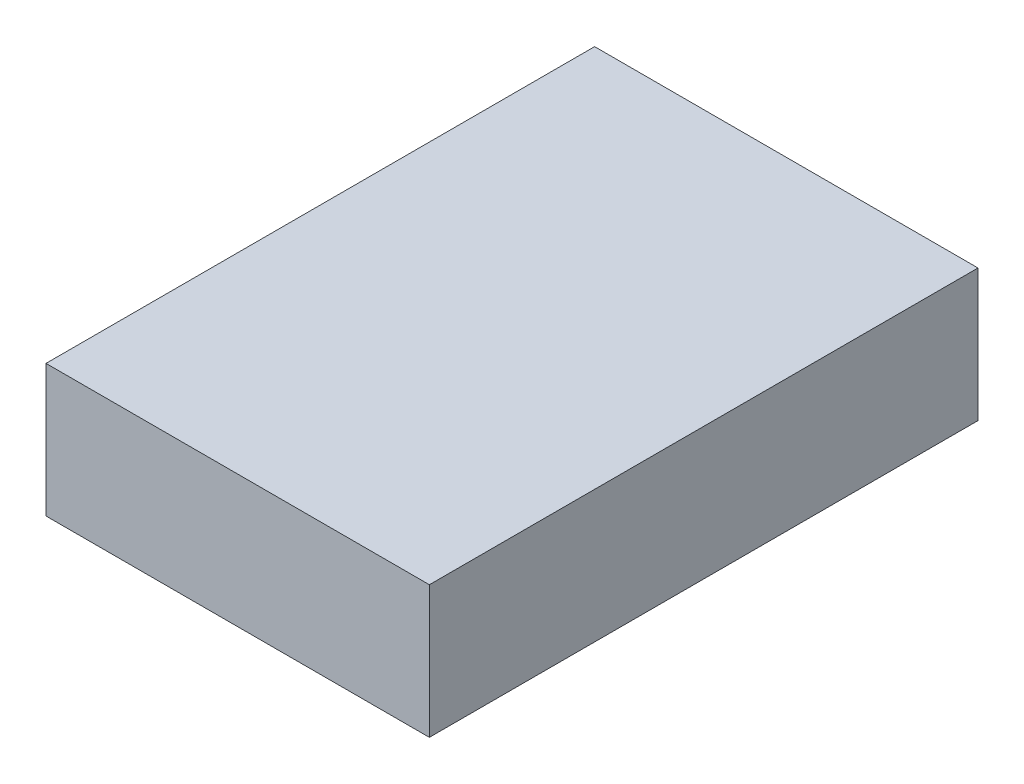
ISO-10303-21;
HEADER;
FILE_DESCRIPTION(('STEP AP214'),'2;1');
FILE_NAME('part.step','',(''),(''),'','','');
FILE_SCHEMA(('AUTOMOTIVE_DESIGN { 1 0 10303 214 1 1 1 1 }'));
ENDSEC;
DATA;
#1=APPLICATION_CONTEXT('core data for automotive mechanical design processes');
#2=APPLICATION_PROTOCOL_DEFINITION('international standard','automotive_design',2000,#1);
#3=PRODUCT_CONTEXT('',#1,'mechanical');
#4=PRODUCT('Part','Part','',(#3));
#5=PRODUCT_RELATED_PRODUCT_CATEGORY('part','',(#4));
#6=PRODUCT_DEFINITION_FORMATION('','',#4);
#7=PRODUCT_DEFINITION_CONTEXT('part definition',#1,'design');
#8=PRODUCT_DEFINITION('design','',#6,#7);
#9=PRODUCT_DEFINITION_SHAPE('','',#8);
#10=(LENGTH_UNIT() NAMED_UNIT(*) SI_UNIT(.MILLI.,.METRE.));
#11=(NAMED_UNIT(*) PLANE_ANGLE_UNIT() SI_UNIT($,.RADIAN.));
#12=(NAMED_UNIT(*) SI_UNIT($,.STERADIAN.) SOLID_ANGLE_UNIT());
#13=UNCERTAINTY_MEASURE_WITH_UNIT(LENGTH_MEASURE(1.E-05),#10,'distance_accuracy_value','');
#14=(GEOMETRIC_REPRESENTATION_CONTEXT(3) GLOBAL_UNCERTAINTY_ASSIGNED_CONTEXT((#13)) GLOBAL_UNIT_ASSIGNED_CONTEXT((#10,
#11,#12)) REPRESENTATION_CONTEXT('',''));
#15=CARTESIAN_POINT('',(0.,0.,0.));
#16=DIRECTION('',(0.,0.,1.));
#17=DIRECTION('',(1.,0.,0.));
#18=AXIS2_PLACEMENT_3D('',#15,#16,#17);
#19=CARTESIAN_POINT('',(-33.3733681462141,20.,-15.2780678851175));
#20=DIRECTION('',(1.,0.,0.));
#21=DIRECTION('',(0.,0.,-1.));
#22=AXIS2_PLACEMENT_3D('',#19,#20,#21);
#23=PLANE('',#22);
#24=DIRECTION('',(0.,0.,1.));
#25=VECTOR('',#24,1.);
#26=CARTESIAN_POINT('',(-33.3733681462141,0.,-15.2780678851175));
#27=LINE('',#26,#25);
#28=CARTESIAN_POINT('',(-33.3733681462141,0.,-15.2780678851175));
#29=VERTEX_POINT('',#28);
#30=CARTESIAN_POINT('',(-33.3733681462141,0.,67.7219321148825));
#31=VERTEX_POINT('',#30);
#32=EDGE_CURVE('E96',#29,#31,#27,.T.);
#33=ORIENTED_EDGE('',*,*,#32,.T.);
#34=DIRECTION('',(0.,-1.,0.));
#35=VECTOR('',#34,1.);
#36=CARTESIAN_POINT('',(-33.3733681462141,20.,67.7219321148825));
#37=LINE('',#36,#35);
#38=CARTESIAN_POINT('',(-33.3733681462141,20.,67.7219321148825));
#39=VERTEX_POINT('',#38);
#40=EDGE_CURVE('E11',#39,#31,#37,.T.);
#41=ORIENTED_EDGE('',*,*,#40,.F.);
#42=DIRECTION('',(0.,0.,1.));
#43=VECTOR('',#42,1.);
#44=CARTESIAN_POINT('',(-33.3733681462141,20.,-15.2780678851175));
#45=LINE('',#44,#43);
#46=CARTESIAN_POINT('',(-33.3733681462141,20.,-15.2780678851175));
#47=VERTEX_POINT('',#46);
#48=EDGE_CURVE('E84',#47,#39,#45,.T.);
#49=ORIENTED_EDGE('',*,*,#48,.F.);
#50=DIRECTION('',(0.,-1.,0.));
#51=VECTOR('',#50,1.);
#52=CARTESIAN_POINT('',(-33.3733681462141,20.,-15.2780678851175));
#53=LINE('',#52,#51);
#54=EDGE_CURVE('E92',#47,#29,#53,.T.);
#55=ORIENTED_EDGE('',*,*,#54,.T.);
#56=EDGE_LOOP('',(#33,#41,#49,#55));
#57=FACE_BOUND('',#56,.T.);
#58=ADVANCED_FACE('F33',(#57),#23,.F.);
#59=CARTESIAN_POINT('',(-33.3733681462141,20.,67.7219321148825));
#60=DIRECTION('',(0.,0.,-1.));
#61=DIRECTION('',(-1.,0.,0.));
#62=AXIS2_PLACEMENT_3D('',#59,#60,#61);
#63=PLANE('',#62);
#64=DIRECTION('',(1.,0.,0.));
#65=VECTOR('',#64,1.);
#66=CARTESIAN_POINT('',(-33.3733681462141,0.,67.7219321148825));
#67=LINE('',#66,#65);
#68=CARTESIAN_POINT('',(24.6266318537859,0.,67.7219321148825));
#69=VERTEX_POINT('',#68);
#70=EDGE_CURVE('E88',#31,#69,#67,.T.);
#71=ORIENTED_EDGE('',*,*,#70,.T.);
#72=DIRECTION('',(0.,-1.,0.));
#73=VECTOR('',#72,1.);
#74=CARTESIAN_POINT('',(24.6266318537859,20.,67.7219321148825));
#75=LINE('',#74,#73);
#76=CARTESIAN_POINT('',(24.6266318537859,20.,67.7219321148825));
#77=VERTEX_POINT('',#76);
#78=EDGE_CURVE('E41',#77,#69,#75,.T.);
#79=ORIENTED_EDGE('',*,*,#78,.F.);
#80=DIRECTION('',(1.,0.,0.));
#81=VECTOR('',#80,1.);
#82=CARTESIAN_POINT('',(-33.3733681462141,20.,67.7219321148825));
#83=LINE('',#82,#81);
#84=EDGE_CURVE('E79',#39,#77,#83,.T.);
#85=ORIENTED_EDGE('',*,*,#84,.F.);
#86=ORIENTED_EDGE('',*,*,#40,.T.);
#87=EDGE_LOOP('',(#71,#79,#85,#86));
#88=FACE_BOUND('',#87,.T.);
#89=ADVANCED_FACE('F87',(#88),#63,.F.);
#90=CARTESIAN_POINT('',(24.6266318537859,20.,-15.2780678851175));
#91=DIRECTION('',(-1.,0.,0.));
#92=DIRECTION('',(0.,0.,1.));
#93=AXIS2_PLACEMENT_3D('',#90,#91,#92);
#94=PLANE('',#93);
#95=DIRECTION('',(0.,0.,-1.));
#96=VECTOR('',#95,1.);
#97=CARTESIAN_POINT('',(24.6266318537859,0.,-15.2780678851175));
#98=LINE('',#97,#96);
#99=CARTESIAN_POINT('',(24.6266318537859,0.,-15.2780678851175));
#100=VERTEX_POINT('',#99);
#101=EDGE_CURVE('E66',#69,#100,#98,.T.);
#102=ORIENTED_EDGE('',*,*,#101,.T.);
#103=DIRECTION('',(0.,-1.,0.));
#104=VECTOR('',#103,1.);
#105=CARTESIAN_POINT('',(24.6266318537859,20.,-15.2780678851175));
#106=LINE('',#105,#104);
#107=CARTESIAN_POINT('',(24.6266318537859,20.,-15.2780678851175));
#108=VERTEX_POINT('',#107);
#109=EDGE_CURVE('E89',#108,#100,#106,.T.);
#110=ORIENTED_EDGE('',*,*,#109,.F.);
#111=DIRECTION('',(0.,0.,-1.));
#112=VECTOR('',#111,1.);
#113=CARTESIAN_POINT('',(24.6266318537859,20.,-15.2780678851175));
#114=LINE('',#113,#112);
#115=EDGE_CURVE('E82',#77,#108,#114,.T.);
#116=ORIENTED_EDGE('',*,*,#115,.F.);
#117=ORIENTED_EDGE('',*,*,#78,.T.);
#118=EDGE_LOOP('',(#102,#110,#116,#117));
#119=FACE_BOUND('',#118,.T.);
#120=ADVANCED_FACE('F90',(#119),#94,.F.);
#121=CARTESIAN_POINT('',(-33.3733681462141,20.,-15.2780678851175));
#122=DIRECTION('',(0.,0.,1.));
#123=DIRECTION('',(1.,0.,0.));
#124=AXIS2_PLACEMENT_3D('',#121,#122,#123);
#125=PLANE('',#124);
#126=DIRECTION('',(-1.,0.,0.));
#127=VECTOR('',#126,1.);
#128=CARTESIAN_POINT('',(-33.3733681462141,0.,-15.2780678851175));
#129=LINE('',#128,#127);
#130=EDGE_CURVE('E72',#100,#29,#129,.T.);
#131=ORIENTED_EDGE('',*,*,#130,.T.);
#132=ORIENTED_EDGE('',*,*,#54,.F.);
#133=DIRECTION('',(-1.,0.,0.));
#134=VECTOR('',#133,1.);
#135=CARTESIAN_POINT('',(-33.3733681462141,20.,-15.2780678851175));
#136=LINE('',#135,#134);
#137=EDGE_CURVE('E49',#108,#47,#136,.T.);
#138=ORIENTED_EDGE('',*,*,#137,.F.);
#139=ORIENTED_EDGE('',*,*,#109,.T.);
#140=EDGE_LOOP('',(#131,#132,#138,#139));
#141=FACE_BOUND('',#140,.T.);
#142=ADVANCED_FACE('F103',(#141),#125,.F.);
#143=CARTESIAN_POINT('',(0.,20.,0.));
#144=DIRECTION('',(0.,1.,0.));
#145=DIRECTION('',(0.,0.,1.));
#146=AXIS2_PLACEMENT_3D('',#143,#144,#145);
#147=PLANE('',#146);
#148=ORIENTED_EDGE('',*,*,#48,.T.);
#149=ORIENTED_EDGE('',*,*,#84,.T.);
#150=ORIENTED_EDGE('',*,*,#115,.T.);
#151=ORIENTED_EDGE('',*,*,#137,.T.);
#152=EDGE_LOOP('',(#148,#149,#150,#151));
#153=FACE_BOUND('',#152,.T.);
#154=ADVANCED_FACE('F80',(#153),#147,.T.);
#155=CARTESIAN_POINT('',(0.,0.,0.));
#156=DIRECTION('',(0.,1.,0.));
#157=DIRECTION('',(0.,0.,1.));
#158=AXIS2_PLACEMENT_3D('',#155,#156,#157);
#159=PLANE('',#158);
#160=ORIENTED_EDGE('',*,*,#32,.F.);
#161=ORIENTED_EDGE('',*,*,#130,.F.);
#162=ORIENTED_EDGE('',*,*,#101,.F.);
#163=ORIENTED_EDGE('',*,*,#70,.F.);
#164=EDGE_LOOP('',(#160,#161,#162,#163));
#165=FACE_BOUND('',#164,.T.);
#166=ADVANCED_FACE('F106',(#165),#159,.F.);
#167=CLOSED_SHELL('',(#58,#89,#120,#142,#154,#166));
#168=MANIFOLD_SOLID_BREP('B2',#167);
#169=ADVANCED_BREP_SHAPE_REPRESENTATION('',(#18,#168),#14);
#170=SHAPE_DEFINITION_REPRESENTATION(#9,#169);
ENDSEC;
END-ISO-10303-21;
